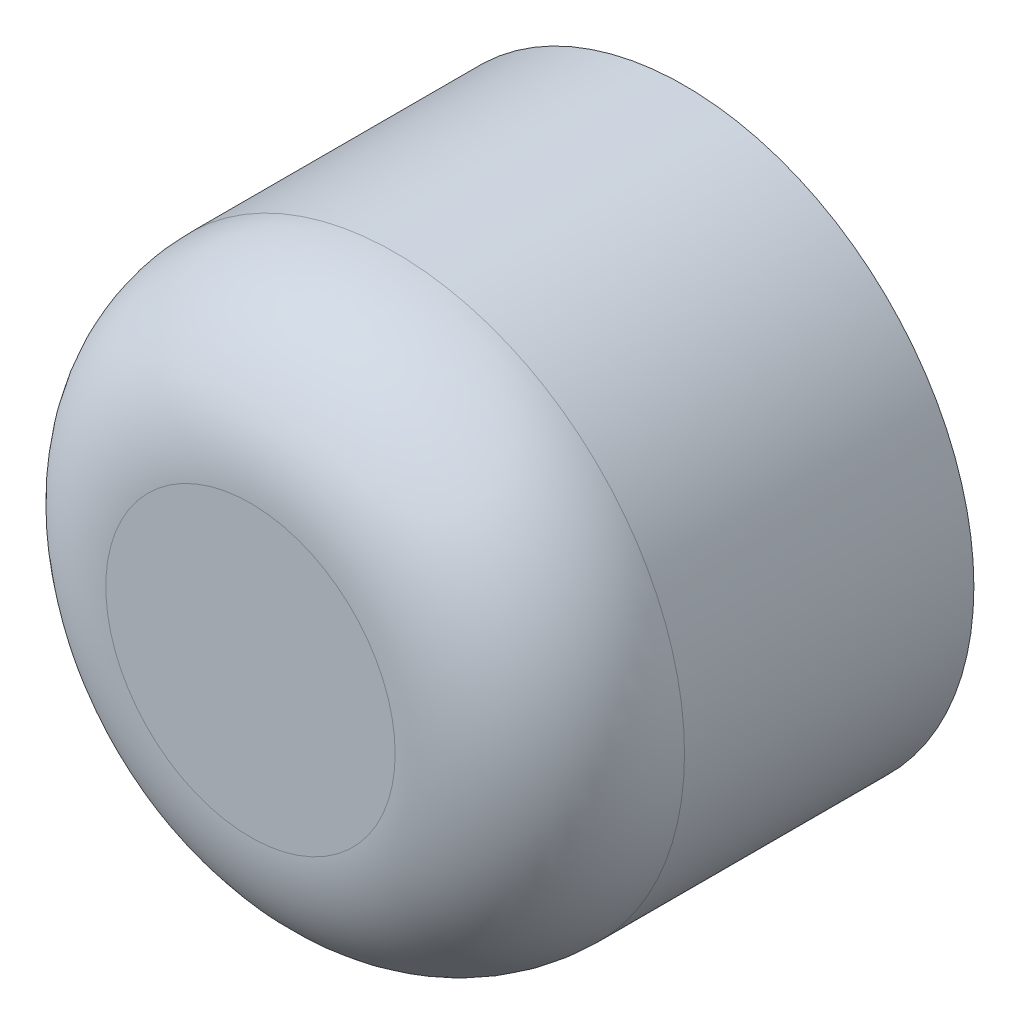
ISO-10303-21;
HEADER;
FILE_DESCRIPTION(('STEP AP214'),'2;1');
FILE_NAME('part.step','',(''),(''),'','','');
FILE_SCHEMA(('AUTOMOTIVE_DESIGN { 1 0 10303 214 1 1 1 1 }'));
ENDSEC;
DATA;
#1=APPLICATION_CONTEXT('core data for automotive mechanical design processes');
#2=APPLICATION_PROTOCOL_DEFINITION('international standard','automotive_design',2000,#1);
#3=PRODUCT_CONTEXT('',#1,'mechanical');
#4=PRODUCT('Part','Part','',(#3));
#5=PRODUCT_RELATED_PRODUCT_CATEGORY('part','',(#4));
#6=PRODUCT_DEFINITION_FORMATION('','',#4);
#7=PRODUCT_DEFINITION_CONTEXT('part definition',#1,'design');
#8=PRODUCT_DEFINITION('design','',#6,#7);
#9=PRODUCT_DEFINITION_SHAPE('','',#8);
#10=(LENGTH_UNIT() NAMED_UNIT(*) SI_UNIT(.MILLI.,.METRE.));
#11=(NAMED_UNIT(*) PLANE_ANGLE_UNIT() SI_UNIT($,.RADIAN.));
#12=(NAMED_UNIT(*) SI_UNIT($,.STERADIAN.) SOLID_ANGLE_UNIT());
#13=UNCERTAINTY_MEASURE_WITH_UNIT(LENGTH_MEASURE(1.E-05),#10,'distance_accuracy_value','');
#14=(GEOMETRIC_REPRESENTATION_CONTEXT(3) GLOBAL_UNCERTAINTY_ASSIGNED_CONTEXT((#13)) GLOBAL_UNIT_ASSIGNED_CONTEXT((#10,
#11,#12)) REPRESENTATION_CONTEXT('',''));
#15=CARTESIAN_POINT('',(0.,0.,0.));
#16=DIRECTION('',(0.,0.,1.));
#17=DIRECTION('',(1.,0.,0.));
#18=AXIS2_PLACEMENT_3D('',#15,#16,#17);
#19=CARTESIAN_POINT('',(0.,0.,76.2));
#20=DIRECTION('',(0.,0.,-1.));
#21=DIRECTION('',(-1.,0.,0.));
#22=AXIS2_PLACEMENT_3D('',#19,#20,#21);
#23=CYLINDRICAL_SURFACE('',#22,50.8);
#24=CARTESIAN_POINT('',(0.,0.,50.8));
#25=DIRECTION('',(0.,0.,1.));
#26=DIRECTION('',(1.,0.,0.));
#27=AXIS2_PLACEMENT_3D('',#24,#25,#26);
#28=CIRCLE('',#27,50.8);
#29=CARTESIAN_POINT('',(-50.8,0.,50.8));
#30=VERTEX_POINT('',#29);
#31=EDGE_CURVE('E10',#30,#30,#28,.F.);
#32=CARTESIAN_POINT('',(0.,0.,0.));
#33=DIRECTION('',(0.,0.,1.));
#34=DIRECTION('',(1.,0.,0.));
#35=AXIS2_PLACEMENT_3D('',#32,#33,#34);
#36=CIRCLE('',#35,50.8);
#37=CARTESIAN_POINT('',(-50.8,0.,0.));
#38=VERTEX_POINT('',#37);
#39=EDGE_CURVE('E62',#38,#38,#36,.T.);
#40=CARTESIAN_POINT('',(-50.8,0.,50.8));
#41=CARTESIAN_POINT('',(-50.8,0.,50.2708333333333));
#42=CARTESIAN_POINT('',(-50.8,0.,49.7416666666667));
#43=CARTESIAN_POINT('',(-50.8,0.,48.6833333333333));
#44=CARTESIAN_POINT('',(-50.8,0.,48.1541666666667));
#45=CARTESIAN_POINT('',(-50.8,0.,47.0958333333333));
#46=CARTESIAN_POINT('',(-50.8,0.,46.5666666666667));
#47=CARTESIAN_POINT('',(-50.8,0.,45.5083333333333));
#48=CARTESIAN_POINT('',(-50.8,0.,44.9791666666667));
#49=CARTESIAN_POINT('',(-50.8,0.,43.9208333333333));
#50=CARTESIAN_POINT('',(-50.8,0.,43.3916666666667));
#51=CARTESIAN_POINT('',(-50.8,0.,42.3333333333333));
#52=CARTESIAN_POINT('',(-50.8,0.,41.8041666666667));
#53=CARTESIAN_POINT('',(-50.8,0.,40.7458333333333));
#54=CARTESIAN_POINT('',(-50.8,0.,40.2166666666667));
#55=CARTESIAN_POINT('',(-50.8,0.,39.1583333333333));
#56=CARTESIAN_POINT('',(-50.8,0.,38.6291666666667));
#57=CARTESIAN_POINT('',(-50.8,0.,37.5708333333333));
#58=CARTESIAN_POINT('',(-50.8,0.,37.0416666666667));
#59=CARTESIAN_POINT('',(-50.8,0.,35.9833333333333));
#60=CARTESIAN_POINT('',(-50.8,0.,35.4541666666667));
#61=CARTESIAN_POINT('',(-50.8,0.,34.3958333333333));
#62=CARTESIAN_POINT('',(-50.8,0.,33.8666666666667));
#63=CARTESIAN_POINT('',(-50.8,0.,32.8083333333333));
#64=CARTESIAN_POINT('',(-50.8,0.,32.2791666666667));
#65=CARTESIAN_POINT('',(-50.8,0.,31.2208333333333));
#66=CARTESIAN_POINT('',(-50.8,0.,30.6916666666667));
#67=CARTESIAN_POINT('',(-50.8,0.,29.6333333333333));
#68=CARTESIAN_POINT('',(-50.8,0.,29.1041666666667));
#69=CARTESIAN_POINT('',(-50.8,0.,28.0458333333333));
#70=CARTESIAN_POINT('',(-50.8,0.,27.5166666666667));
#71=CARTESIAN_POINT('',(-50.8,0.,26.4583333333333));
#72=CARTESIAN_POINT('',(-50.8,0.,25.9291666666667));
#73=CARTESIAN_POINT('',(-50.8,0.,24.8708333333333));
#74=CARTESIAN_POINT('',(-50.8,0.,24.3416666666667));
#75=CARTESIAN_POINT('',(-50.8,0.,23.2833333333333));
#76=CARTESIAN_POINT('',(-50.8,0.,22.7541666666667));
#77=CARTESIAN_POINT('',(-50.8,0.,21.6958333333333));
#78=CARTESIAN_POINT('',(-50.8,0.,21.1666666666667));
#79=CARTESIAN_POINT('',(-50.8,0.,20.1083333333333));
#80=CARTESIAN_POINT('',(-50.8,0.,19.5791666666667));
#81=CARTESIAN_POINT('',(-50.8,0.,18.5208333333333));
#82=CARTESIAN_POINT('',(-50.8,0.,17.9916666666667));
#83=CARTESIAN_POINT('',(-50.8,0.,16.9333333333333));
#84=CARTESIAN_POINT('',(-50.8,0.,16.4041666666667));
#85=CARTESIAN_POINT('',(-50.8,0.,15.3458333333333));
#86=CARTESIAN_POINT('',(-50.8,0.,14.8166666666667));
#87=CARTESIAN_POINT('',(-50.8,0.,13.7583333333333));
#88=CARTESIAN_POINT('',(-50.8,0.,13.2291666666667));
#89=CARTESIAN_POINT('',(-50.8,0.,12.1708333333333));
#90=CARTESIAN_POINT('',(-50.8,0.,11.6416666666667));
#91=CARTESIAN_POINT('',(-50.8,0.,10.5833333333333));
#92=CARTESIAN_POINT('',(-50.8,0.,10.0541666666667));
#93=CARTESIAN_POINT('',(-50.8,0.,8.99583333333334));
#94=CARTESIAN_POINT('',(-50.8,0.,8.46666666666667));
#95=CARTESIAN_POINT('',(-50.8,0.,7.40833333333333));
#96=CARTESIAN_POINT('',(-50.8,0.,6.87916666666666));
#97=CARTESIAN_POINT('',(-50.8,0.,5.82083333333333));
#98=CARTESIAN_POINT('',(-50.8,0.,5.29166666666667));
#99=CARTESIAN_POINT('',(-50.8,0.,4.23333333333333));
#100=CARTESIAN_POINT('',(-50.8,0.,3.70416666666667));
#101=CARTESIAN_POINT('',(-50.8,0.,2.64583333333333));
#102=CARTESIAN_POINT('',(-50.8,0.,2.11666666666666));
#103=CARTESIAN_POINT('',(-50.8,0.,1.05833333333333));
#104=CARTESIAN_POINT('',(-50.8,0.,0.529166666666664));
#105=CARTESIAN_POINT('',(-50.8,0.,0.));
#106=B_SPLINE_CURVE_WITH_KNOTS('',3,(#40,#41,#42,#43,#44,#45,#46,#47,#48,#49,#50,#51,#52,#53,
#54,#55,#56,#57,#58,#59,#60,#61,#62,#63,#64,#65,#66,#67,#68,#69,#70,#71,#72,#73,#74,#75,#76,#77,
#78,#79,#80,#81,#82,#83,#84,#85,#86,#87,#88,#89,#90,#91,#92,#93,#94,#95,#96,#97,#98,#99,#100,
#101,#102,#103,#104,#105),.UNSPECIFIED.,.F.,.F.,(4,2,2,2,2,2,2,2,2,2,2,2,2,2,2,2,2,2,2,2,2,2,2,
2,2,2,2,2,2,2,2,2,4),(0.,1.58750000000001,3.175,4.7625,6.35,7.9375,9.525,11.1125,12.7,14.2875,
15.875,17.4625,19.05,20.6375,22.225,23.8125,25.4,26.9875,28.575,30.1625,31.75,33.3375,34.925,
36.5125,38.1,39.6875,41.275,42.8625,44.45,46.0375,47.625,49.2125,50.8),.UNSPECIFIED.);
#107=EDGE_CURVE('BSEAM49',#30,#38,#106,.T.);
#108=ORIENTED_EDGE('',*,*,#31,.T.);
#109=ORIENTED_EDGE('',*,*,#39,.T.);
#110=ORIENTED_EDGE('',*,*,#107,.T.);
#111=ORIENTED_EDGE('',*,*,#107,.F.);
#112=EDGE_LOOP('',(#108,#110,#109,#111));
#113=FACE_BOUND('',#112,.T.);
#114=ADVANCED_FACE('F49',(#113),#23,.T.);
#115=CARTESIAN_POINT('',(0.,0.,76.2));
#116=DIRECTION('',(0.,0.,1.));
#117=DIRECTION('',(1.,0.,0.));
#118=AXIS2_PLACEMENT_3D('',#115,#116,#117);
#119=PLANE('',#118);
#120=CARTESIAN_POINT('',(0.,0.,76.2));
#121=DIRECTION('',(0.,0.,1.));
#122=DIRECTION('',(1.,0.,0.));
#123=AXIS2_PLACEMENT_3D('',#120,#121,#122);
#124=CIRCLE('',#123,25.4);
#125=CARTESIAN_POINT('',(25.4,0.,76.2));
#126=VERTEX_POINT('',#125);
#127=EDGE_CURVE('E57',#126,#126,#124,.T.);
#128=ORIENTED_EDGE('',*,*,#127,.T.);
#129=EDGE_LOOP('',(#128));
#130=FACE_BOUND('',#129,.T.);
#131=ADVANCED_FACE('F73',(#130),#119,.T.);
#132=CARTESIAN_POINT('',(0.,0.,0.));
#133=DIRECTION('',(0.,0.,1.));
#134=DIRECTION('',(1.,0.,0.));
#135=AXIS2_PLACEMENT_3D('',#132,#133,#134);
#136=PLANE('',#135);
#137=ORIENTED_EDGE('',*,*,#39,.F.);
#138=EDGE_LOOP('',(#137));
#139=FACE_BOUND('',#138,.T.);
#140=ADVANCED_FACE('F71',(#139),#136,.F.);
#141=CARTESIAN_POINT('',(0.,0.,50.8));
#142=DIRECTION('',(0.,0.,1.));
#143=DIRECTION('',(1.,0.,0.));
#144=AXIS2_PLACEMENT_3D('',#141,#142,#143);
#145=DEGENERATE_TOROIDAL_SURFACE('',#144,25.4,25.4,.T.);
#146=ORIENTED_EDGE('',*,*,#31,.F.);
#147=EDGE_LOOP('',(#146));
#148=FACE_BOUND('',#147,.T.);
#149=ORIENTED_EDGE('',*,*,#127,.F.);
#150=EDGE_LOOP('',(#149));
#151=FACE_BOUND('',#150,.T.);
#152=ADVANCED_FACE('F51',(#148,#151),#145,.T.);
#153=CLOSED_SHELL('',(#114,#131,#140,#152));
#154=MANIFOLD_SOLID_BREP('B2',#153);
#155=ADVANCED_BREP_SHAPE_REPRESENTATION('',(#18,#154),#14);
#156=SHAPE_DEFINITION_REPRESENTATION(#9,#155);
ENDSEC;
END-ISO-10303-21;
